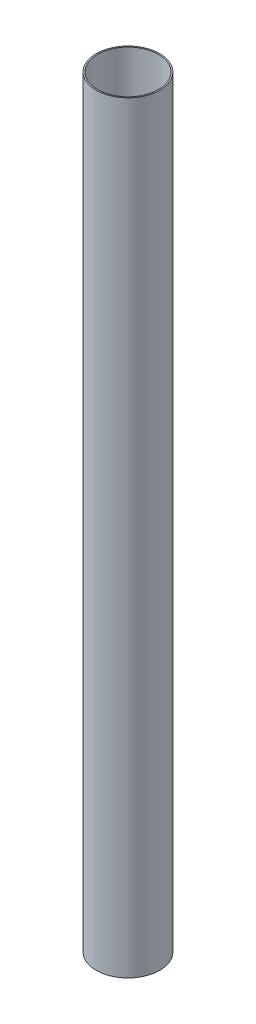
ISO-10303-21;
HEADER;
FILE_DESCRIPTION(('STEP AP214'),'2;1');
FILE_NAME('part.step','',(''),(''),'','','');
FILE_SCHEMA(('AUTOMOTIVE_DESIGN { 1 0 10303 214 1 1 1 1 }'));
ENDSEC;
DATA;
#1=APPLICATION_CONTEXT('core data for automotive mechanical design processes');
#2=APPLICATION_PROTOCOL_DEFINITION('international standard','automotive_design',2000,#1);
#3=PRODUCT_CONTEXT('',#1,'mechanical');
#4=PRODUCT('Part','Part','',(#3));
#5=PRODUCT_RELATED_PRODUCT_CATEGORY('part','',(#4));
#6=PRODUCT_DEFINITION_FORMATION('','',#4);
#7=PRODUCT_DEFINITION_CONTEXT('part definition',#1,'design');
#8=PRODUCT_DEFINITION('design','',#6,#7);
#9=PRODUCT_DEFINITION_SHAPE('','',#8);
#10=(LENGTH_UNIT() NAMED_UNIT(*) SI_UNIT(.MILLI.,.METRE.));
#11=(NAMED_UNIT(*) PLANE_ANGLE_UNIT() SI_UNIT($,.RADIAN.));
#12=(NAMED_UNIT(*) SI_UNIT($,.STERADIAN.) SOLID_ANGLE_UNIT());
#13=UNCERTAINTY_MEASURE_WITH_UNIT(LENGTH_MEASURE(1.E-05),#10,'distance_accuracy_value','');
#14=(GEOMETRIC_REPRESENTATION_CONTEXT(3) GLOBAL_UNCERTAINTY_ASSIGNED_CONTEXT((#13)) GLOBAL_UNIT_ASSIGNED_CONTEXT((#10,
#11,#12)) REPRESENTATION_CONTEXT('',''));
#15=CARTESIAN_POINT('',(0.,0.,0.));
#16=DIRECTION('',(0.,0.,1.));
#17=DIRECTION('',(1.,0.,0.));
#18=AXIS2_PLACEMENT_3D('',#15,#16,#17);
#19=CARTESIAN_POINT('',(-6.5487619065686,1500.,11.4038784924729));
#20=DIRECTION('',(0.,1.,0.));
#21=DIRECTION('',(0.,0.,1.));
#22=AXIS2_PLACEMENT_3D('',#19,#20,#21);
#23=PLANE('',#22);
#24=CARTESIAN_POINT('',(-6.5487619065686,1500.,11.4038784924729));
#25=DIRECTION('',(0.,1.,0.));
#26=DIRECTION('',(0.,0.,1.));
#27=AXIS2_PLACEMENT_3D('',#24,#25,#26);
#28=CIRCLE('',#27,62.5);
#29=CARTESIAN_POINT('',(-6.5487619065686,1500.,73.9038784924729));
#30=VERTEX_POINT('',#29);
#31=EDGE_CURVE('E10',#30,#30,#28,.T.);
#32=ORIENTED_EDGE('',*,*,#31,.T.);
#33=EDGE_LOOP('',(#32));
#34=FACE_BOUND('',#33,.T.);
#35=CARTESIAN_POINT('',(-6.5487619065686,1500.,11.4038784924729));
#36=DIRECTION('',(0.,1.,0.));
#37=DIRECTION('',(0.,0.,1.));
#38=AXIS2_PLACEMENT_3D('',#35,#36,#37);
#39=CIRCLE('',#38,60.);
#40=CARTESIAN_POINT('',(-6.5487619065686,1500.,71.4038784924729));
#41=VERTEX_POINT('',#40);
#42=EDGE_CURVE('E50',#41,#41,#39,.T.);
#43=ORIENTED_EDGE('',*,*,#42,.F.);
#44=EDGE_LOOP('',(#43));
#45=FACE_BOUND('',#44,.T.);
#46=ADVANCED_FACE('F39',(#34,#45),#23,.T.);
#47=CARTESIAN_POINT('',(-6.5487619065686,0.,11.4038784924729));
#48=DIRECTION('',(0.,1.,0.));
#49=DIRECTION('',(0.,0.,1.));
#50=AXIS2_PLACEMENT_3D('',#47,#48,#49);
#51=PLANE('',#50);
#52=CARTESIAN_POINT('',(-6.5487619065686,0.,11.4038784924729));
#53=DIRECTION('',(0.,1.,0.));
#54=DIRECTION('',(0.,0.,1.));
#55=AXIS2_PLACEMENT_3D('',#52,#53,#54);
#56=CIRCLE('',#55,62.5);
#57=CARTESIAN_POINT('',(-6.5487619065686,0.,73.9038784924729));
#58=VERTEX_POINT('',#57);
#59=EDGE_CURVE('E43',#58,#58,#56,.T.);
#60=ORIENTED_EDGE('',*,*,#59,.F.);
#61=EDGE_LOOP('',(#60));
#62=FACE_BOUND('',#61,.T.);
#63=CARTESIAN_POINT('',(-6.5487619065686,0.,11.4038784924729));
#64=DIRECTION('',(0.,1.,0.));
#65=DIRECTION('',(0.,0.,1.));
#66=AXIS2_PLACEMENT_3D('',#63,#64,#65);
#67=CIRCLE('',#66,60.);
#68=CARTESIAN_POINT('',(-6.5487619065686,0.,71.4038784924729));
#69=VERTEX_POINT('',#68);
#70=EDGE_CURVE('E52',#69,#69,#67,.T.);
#71=ORIENTED_EDGE('',*,*,#70,.T.);
#72=EDGE_LOOP('',(#71));
#73=FACE_BOUND('',#72,.T.);
#74=ADVANCED_FACE('F62',(#62,#73),#51,.F.);
#75=CARTESIAN_POINT('',(-6.5487619065686,1500.,11.4038784924729));
#76=DIRECTION('',(0.,-1.,0.));
#77=DIRECTION('',(0.,0.,-1.));
#78=AXIS2_PLACEMENT_3D('',#75,#76,#77);
#79=CYLINDRICAL_SURFACE('',#78,62.5);
#80=ORIENTED_EDGE('',*,*,#31,.F.);
#81=EDGE_LOOP('',(#80));
#82=FACE_BOUND('',#81,.T.);
#83=ORIENTED_EDGE('',*,*,#59,.T.);
#84=EDGE_LOOP('',(#83));
#85=FACE_BOUND('',#84,.T.);
#86=ADVANCED_FACE('F41',(#82,#85),#79,.T.);
#87=CARTESIAN_POINT('',(-6.5487619065686,1500.,11.4038784924729));
#88=DIRECTION('',(0.,-1.,0.));
#89=DIRECTION('',(0.,0.,-1.));
#90=AXIS2_PLACEMENT_3D('',#87,#88,#89);
#91=CYLINDRICAL_SURFACE('',#90,60.);
#92=ORIENTED_EDGE('',*,*,#42,.T.);
#93=EDGE_LOOP('',(#92));
#94=FACE_BOUND('',#93,.T.);
#95=ORIENTED_EDGE('',*,*,#70,.F.);
#96=EDGE_LOOP('',(#95));
#97=FACE_BOUND('',#96,.T.);
#98=ADVANCED_FACE('F58',(#94,#97),#91,.F.);
#99=CLOSED_SHELL('',(#46,#74,#86,#98));
#100=MANIFOLD_SOLID_BREP('B2',#99);
#101=ADVANCED_BREP_SHAPE_REPRESENTATION('',(#18,#100),#14);
#102=SHAPE_DEFINITION_REPRESENTATION(#9,#101);
ENDSEC;
END-ISO-10303-21;
